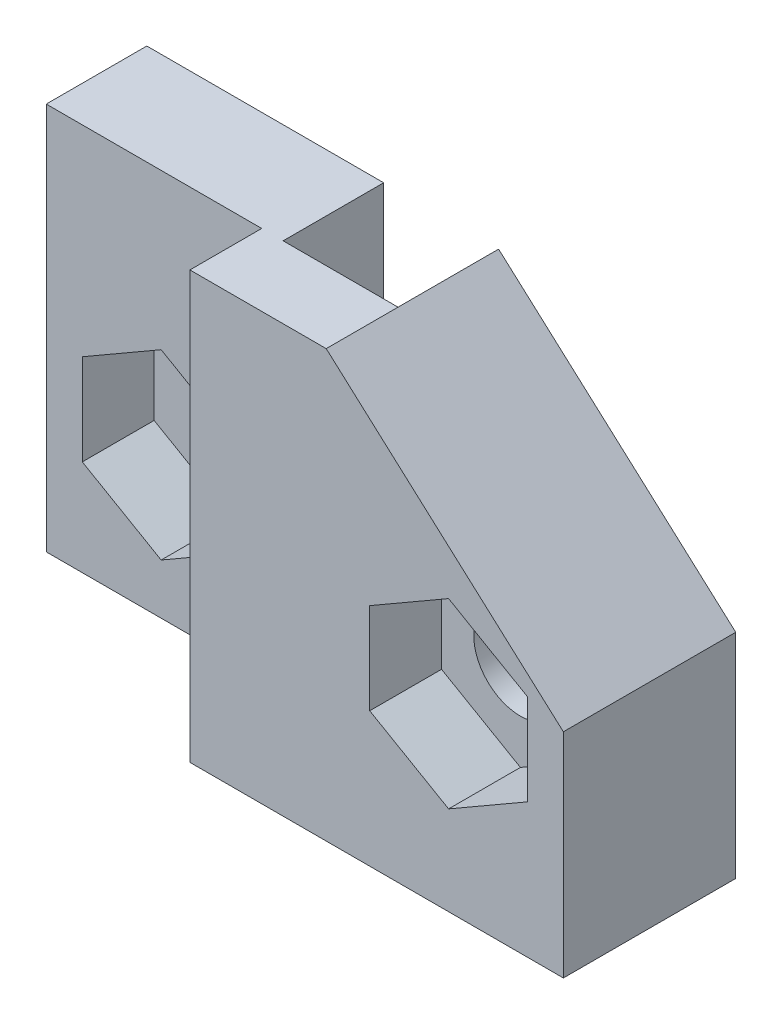
ISO-10303-21;
HEADER;
FILE_DESCRIPTION(('STEP AP214'),'2;1');
FILE_NAME('part.step','',(''),(''),'','','');
FILE_SCHEMA(('AUTOMOTIVE_DESIGN { 1 0 10303 214 1 1 1 1 }'));
ENDSEC;
DATA;
#1=APPLICATION_CONTEXT('core data for automotive mechanical design processes');
#2=APPLICATION_PROTOCOL_DEFINITION('international standard','automotive_design',2000,#1);
#3=PRODUCT_CONTEXT('',#1,'mechanical');
#4=PRODUCT('Part','Part','',(#3));
#5=PRODUCT_RELATED_PRODUCT_CATEGORY('part','',(#4));
#6=PRODUCT_DEFINITION_FORMATION('','',#4);
#7=PRODUCT_DEFINITION_CONTEXT('part definition',#1,'design');
#8=PRODUCT_DEFINITION('design','',#6,#7);
#9=PRODUCT_DEFINITION_SHAPE('','',#8);
#10=(LENGTH_UNIT() NAMED_UNIT(*) SI_UNIT(.MILLI.,.METRE.));
#11=(NAMED_UNIT(*) PLANE_ANGLE_UNIT() SI_UNIT($,.RADIAN.));
#12=(NAMED_UNIT(*) SI_UNIT($,.STERADIAN.) SOLID_ANGLE_UNIT());
#13=UNCERTAINTY_MEASURE_WITH_UNIT(LENGTH_MEASURE(1.E-05),#10,'distance_accuracy_value','');
#14=(GEOMETRIC_REPRESENTATION_CONTEXT(3) GLOBAL_UNCERTAINTY_ASSIGNED_CONTEXT((#13)) GLOBAL_UNIT_ASSIGNED_CONTEXT((#10,
#11,#12)) REPRESENTATION_CONTEXT('',''));
#15=CARTESIAN_POINT('',(0.,0.,0.));
#16=DIRECTION('',(0.,0.,1.));
#17=DIRECTION('',(1.,0.,0.));
#18=AXIS2_PLACEMENT_3D('',#15,#16,#17);
#19=CARTESIAN_POINT('',(169.47767153,-75.223646,0.));
#20=DIRECTION('',(1.,0.,0.));
#21=DIRECTION('',(0.,0.,-1.));
#22=AXIS2_PLACEMENT_3D('',#19,#20,#21);
#23=PLANE('',#22);
#24=DIRECTION('',(0.,0.,1.));
#25=VECTOR('',#24,1.);
#26=CARTESIAN_POINT('',(169.47767153,-66.648646,0.));
#27=LINE('',#26,#25);
#28=CARTESIAN_POINT('',(169.47767153,-66.648646,0.));
#29=VERTEX_POINT('',#28);
#30=CARTESIAN_POINT('',(169.47767153,-66.648646,3.5));
#31=VERTEX_POINT('',#30);
#32=EDGE_CURVE('E213',#29,#31,#27,.T.);
#33=ORIENTED_EDGE('',*,*,#32,.T.);
#34=DIRECTION('',(0.,-1.,0.));
#35=VECTOR('',#34,1.);
#36=CARTESIAN_POINT('',(169.47767153,-66.648646,3.5));
#37=LINE('',#36,#35);
#38=CARTESIAN_POINT('',(169.47767153,-75.223646,3.5));
#39=VERTEX_POINT('',#38);
#40=EDGE_CURVE('E199',#31,#39,#37,.T.);
#41=ORIENTED_EDGE('',*,*,#40,.T.);
#42=DIRECTION('',(0.,0.,1.));
#43=VECTOR('',#42,1.);
#44=CARTESIAN_POINT('',(169.47767153,-75.223646,0.));
#45=LINE('',#44,#43);
#46=CARTESIAN_POINT('',(169.47767153,-75.223646,0.));
#47=VERTEX_POINT('',#46);
#48=EDGE_CURVE('E210',#47,#39,#45,.T.);
#49=ORIENTED_EDGE('',*,*,#48,.F.);
#50=DIRECTION('',(0.,1.,0.));
#51=VECTOR('',#50,1.);
#52=CARTESIAN_POINT('',(169.47767153,-75.223646,0.));
#53=LINE('',#52,#51);
#54=EDGE_CURVE('E309',#47,#29,#53,.T.);
#55=ORIENTED_EDGE('',*,*,#54,.T.);
#56=EDGE_LOOP('',(#33,#41,#49,#55));
#57=FACE_BOUND('',#56,.T.);
#58=ADVANCED_FACE('F33',(#57),#23,.T.);
#59=CARTESIAN_POINT('',(173.47767153,-75.223646,0.));
#60=DIRECTION('',(0.,1.,0.));
#61=DIRECTION('',(0.,0.,1.));
#62=AXIS2_PLACEMENT_3D('',#59,#60,#61);
#63=PLANE('',#62);
#64=ORIENTED_EDGE('',*,*,#48,.T.);
#65=DIRECTION('',(1.,0.,0.));
#66=VECTOR('',#65,1.);
#67=CARTESIAN_POINT('',(169.47767153,-75.223646,3.5));
#68=LINE('',#67,#66);
#69=CARTESIAN_POINT('',(173.47767153,-75.223646,3.5));
#70=VERTEX_POINT('',#69);
#71=EDGE_CURVE('E195',#39,#70,#68,.T.);
#72=ORIENTED_EDGE('',*,*,#71,.T.);
#73=DIRECTION('',(0.,0.,1.));
#74=VECTOR('',#73,1.);
#75=CARTESIAN_POINT('',(173.47767153,-75.223646,0.));
#76=LINE('',#75,#74);
#77=CARTESIAN_POINT('',(173.47767153,-75.223646,0.));
#78=VERTEX_POINT('',#77);
#79=EDGE_CURVE('E219',#78,#70,#76,.T.);
#80=ORIENTED_EDGE('',*,*,#79,.F.);
#81=DIRECTION('',(-1.,0.,0.));
#82=VECTOR('',#81,1.);
#83=CARTESIAN_POINT('',(173.47767153,-75.223646,0.));
#84=LINE('',#83,#82);
#85=EDGE_CURVE('E218',#78,#47,#84,.T.);
#86=ORIENTED_EDGE('',*,*,#85,.T.);
#87=EDGE_LOOP('',(#64,#72,#80,#86));
#88=FACE_BOUND('',#87,.T.);
#89=ADVANCED_FACE('F216',(#88),#63,.T.);
#90=CARTESIAN_POINT('',(173.47767153,-75.223646,0.));
#91=DIRECTION('',(-1.,0.,0.));
#92=DIRECTION('',(0.,0.,1.));
#93=AXIS2_PLACEMENT_3D('',#90,#91,#92);
#94=PLANE('',#93);
#95=ORIENTED_EDGE('',*,*,#79,.T.);
#96=DIRECTION('',(0.,1.,0.));
#97=VECTOR('',#96,1.);
#98=CARTESIAN_POINT('',(173.47767153,-66.648646,3.5));
#99=LINE('',#98,#97);
#100=CARTESIAN_POINT('',(173.47767153,-66.648646,3.5));
#101=VERTEX_POINT('',#100);
#102=EDGE_CURVE('E202',#70,#101,#99,.T.);
#103=ORIENTED_EDGE('',*,*,#102,.T.);
#104=DIRECTION('',(0.,0.,1.));
#105=VECTOR('',#104,1.);
#106=CARTESIAN_POINT('',(173.47767153,-66.648646,0.));
#107=LINE('',#106,#105);
#108=CARTESIAN_POINT('',(173.47767153,-66.648646,0.));
#109=VERTEX_POINT('',#108);
#110=EDGE_CURVE('E223',#109,#101,#107,.T.);
#111=ORIENTED_EDGE('',*,*,#110,.F.);
#112=DIRECTION('',(0.,-1.,0.));
#113=VECTOR('',#112,1.);
#114=CARTESIAN_POINT('',(173.47767153,-75.223646,0.));
#115=LINE('',#114,#113);
#116=EDGE_CURVE('E305',#109,#78,#115,.T.);
#117=ORIENTED_EDGE('',*,*,#116,.T.);
#118=EDGE_LOOP('',(#95,#103,#111,#117));
#119=FACE_BOUND('',#118,.T.);
#120=ADVANCED_FACE('F359',(#119),#94,.T.);
#121=CARTESIAN_POINT('',(165.232371,-75.223646,3.5));
#122=DIRECTION('',(0.,0.,-1.));
#123=DIRECTION('',(-1.,0.,0.));
#124=AXIS2_PLACEMENT_3D('',#121,#122,#123);
#125=CYLINDRICAL_SURFACE('',#124,1.5);
#126=CARTESIAN_POINT('',(165.232371,-75.223646,0.));
#127=DIRECTION('',(0.,0.,1.));
#128=DIRECTION('',(1.,0.,0.));
#129=AXIS2_PLACEMENT_3D('',#126,#127,#128);
#130=CIRCLE('',#129,1.5);
#131=CARTESIAN_POINT('',(166.732371,-75.223646,0.));
#132=VERTEX_POINT('',#131);
#133=EDGE_CURVE('E230',#132,#132,#130,.T.);
#134=ORIENTED_EDGE('',*,*,#133,.F.);
#135=EDGE_LOOP('',(#134));
#136=FACE_BOUND('',#135,.T.);
#137=CARTESIAN_POINT('',(165.232371,-75.223646,1.));
#138=DIRECTION('',(0.,0.,1.));
#139=DIRECTION('',(1.,0.,0.));
#140=AXIS2_PLACEMENT_3D('',#137,#138,#139);
#141=CIRCLE('',#140,1.5);
#142=CARTESIAN_POINT('',(166.732371,-75.223646,1.));
#143=VERTEX_POINT('',#142);
#144=EDGE_CURVE('E37',#143,#143,#141,.T.);
#145=ORIENTED_EDGE('',*,*,#144,.T.);
#146=EDGE_LOOP('',(#145));
#147=FACE_BOUND('',#146,.T.);
#148=ADVANCED_FACE('F483',(#136,#147),#125,.F.);
#149=CARTESIAN_POINT('',(177.73707047,-75.223646,0.));
#150=DIRECTION('',(0.,0.,1.));
#151=DIRECTION('',(1.,0.,0.));
#152=AXIS2_PLACEMENT_3D('',#149,#150,#151);
#153=CYLINDRICAL_SURFACE('',#152,1.62499999999998);
#154=CARTESIAN_POINT('',(177.73707047,-75.223646,0.));
#155=DIRECTION('',(0.,0.,1.));
#156=DIRECTION('',(1.,0.,0.));
#157=AXIS2_PLACEMENT_3D('',#154,#155,#156);
#158=CIRCLE('',#157,1.62499999999998);
#159=CARTESIAN_POINT('',(179.36207047,-75.223646,0.));
#160=VERTEX_POINT('',#159);
#161=EDGE_CURVE('E299',#160,#160,#158,.T.);
#162=ORIENTED_EDGE('',*,*,#161,.F.);
#163=EDGE_LOOP('',(#162));
#164=FACE_BOUND('',#163,.T.);
#165=CARTESIAN_POINT('',(177.73707047,-75.223646,3.5));
#166=DIRECTION('',(0.,0.,1.));
#167=DIRECTION('',(1.,0.,0.));
#168=AXIS2_PLACEMENT_3D('',#165,#166,#167);
#169=CIRCLE('',#168,1.62499999999998);
#170=CARTESIAN_POINT('',(179.36207047,-75.223646,3.5));
#171=VERTEX_POINT('',#170);
#172=EDGE_CURVE('E261',#171,#171,#169,.F.);
#173=ORIENTED_EDGE('',*,*,#172,.F.);
#174=EDGE_LOOP('',(#173));
#175=FACE_BOUND('',#174,.T.);
#176=ADVANCED_FACE('F488',(#164,#175),#153,.F.);
#177=CARTESIAN_POINT('',(0.,0.,3.5));
#178=DIRECTION('',(0.,0.,1.));
#179=DIRECTION('',(1.,0.,0.));
#180=AXIS2_PLACEMENT_3D('',#177,#178,#179);
#181=PLANE('',#180);
#182=DIRECTION('',(0.86602540378444,-0.499999999999998,0.));
#183=VECTOR('',#182,1.);
#184=CARTESIAN_POINT('',(162.487070470003,-76.808646,3.5));
#185=LINE('',#184,#183);
#186=CARTESIAN_POINT('',(162.487070470003,-76.808646,3.5));
#187=VERTEX_POINT('',#186);
#188=CARTESIAN_POINT('',(165.232371,-78.393646,3.5));
#189=VERTEX_POINT('',#188);
#190=EDGE_CURVE('E50',#187,#189,#185,.T.);
#191=ORIENTED_EDGE('',*,*,#190,.F.);
#192=DIRECTION('',(0.,-1.,0.));
#193=VECTOR('',#192,1.);
#194=CARTESIAN_POINT('',(162.487070470003,-73.638646,3.5));
#195=LINE('',#194,#193);
#196=CARTESIAN_POINT('',(162.487070470003,-73.638646,3.5));
#197=VERTEX_POINT('',#196);
#198=EDGE_CURVE('E372',#197,#187,#195,.T.);
#199=ORIENTED_EDGE('',*,*,#198,.F.);
#200=DIRECTION('',(-0.866025403784438,-0.500000000000001,0.));
#201=VECTOR('',#200,1.);
#202=CARTESIAN_POINT('',(165.232371,-72.053646,3.5));
#203=LINE('',#202,#201);
#204=CARTESIAN_POINT('',(165.232371,-72.053646,3.5));
#205=VERTEX_POINT('',#204);
#206=EDGE_CURVE('E396',#205,#197,#203,.T.);
#207=ORIENTED_EDGE('',*,*,#206,.F.);
#208=DIRECTION('',(-0.866025403784439,0.499999999999999,0.));
#209=VECTOR('',#208,1.);
#210=CARTESIAN_POINT('',(167.977671529997,-73.638646,3.5));
#211=LINE('',#210,#209);
#212=CARTESIAN_POINT('',(167.977671529997,-73.638646,3.5));
#213=VERTEX_POINT('',#212);
#214=EDGE_CURVE('E393',#213,#205,#211,.T.);
#215=ORIENTED_EDGE('',*,*,#214,.F.);
#216=DIRECTION('',(0.,1.,0.));
#217=VECTOR('',#216,1.);
#218=CARTESIAN_POINT('',(167.977671529997,-76.808646,3.5));
#219=LINE('',#218,#217);
#220=CARTESIAN_POINT('',(167.977671529997,-76.808646,3.5));
#221=VERTEX_POINT('',#220);
#222=EDGE_CURVE('E390',#221,#213,#219,.T.);
#223=ORIENTED_EDGE('',*,*,#222,.F.);
#224=DIRECTION('',(0.86602540378444,0.499999999999998,0.));
#225=VECTOR('',#224,1.);
#226=CARTESIAN_POINT('',(165.232371,-78.393646,3.5));
#227=LINE('',#226,#225);
#228=EDGE_CURVE('E363',#189,#221,#227,.T.);
#229=ORIENTED_EDGE('',*,*,#228,.F.);
#230=EDGE_LOOP('',(#191,#199,#207,#215,#223,#229));
#231=FACE_BOUND('',#230,.T.);
#232=DIRECTION('',(0.,1.,0.));
#233=VECTOR('',#232,1.);
#234=CARTESIAN_POINT('',(168.732371,-66.648646,3.5));
#235=LINE('',#234,#233);
#236=CARTESIAN_POINT('',(168.732371,-81.493646,3.5));
#237=VERTEX_POINT('',#236);
#238=CARTESIAN_POINT('',(168.732371,-66.648646,3.5));
#239=VERTEX_POINT('',#238);
#240=EDGE_CURVE('E235',#237,#239,#235,.T.);
#241=ORIENTED_EDGE('',*,*,#240,.T.);
#242=DIRECTION('',(-1.,0.,0.));
#243=VECTOR('',#242,1.);
#244=CARTESIAN_POINT('',(168.732371,-66.648646,3.5));
#245=LINE('',#244,#243);
#246=CARTESIAN_POINT('',(161.232371,-66.648646,3.5));
#247=VERTEX_POINT('',#246);
#248=EDGE_CURVE('E238',#239,#247,#245,.T.);
#249=ORIENTED_EDGE('',*,*,#248,.T.);
#250=DIRECTION('',(0.,-1.,0.));
#251=VECTOR('',#250,1.);
#252=CARTESIAN_POINT('',(161.232371,-80.148646,3.5));
#253=LINE('',#252,#251);
#254=CARTESIAN_POINT('',(161.232371,-80.148646,3.5));
#255=VERTEX_POINT('',#254);
#256=EDGE_CURVE('E241',#247,#255,#253,.T.);
#257=ORIENTED_EDGE('',*,*,#256,.T.);
#258=DIRECTION('',(1.,0.,0.));
#259=VECTOR('',#258,1.);
#260=CARTESIAN_POINT('',(161.232371,-80.148646,3.5));
#261=LINE('',#260,#259);
#262=CARTESIAN_POINT('',(167.387371,-80.148646,3.5));
#263=VERTEX_POINT('',#262);
#264=EDGE_CURVE('E243',#255,#263,#261,.T.);
#265=ORIENTED_EDGE('',*,*,#264,.T.);
#266=DIRECTION('',(0.707106781186551,-0.707106781186544,0.));
#267=VECTOR('',#266,1.);
#268=CARTESIAN_POINT('',(168.732371,-81.493646,3.5));
#269=LINE('',#268,#267);
#270=EDGE_CURVE('E245',#263,#237,#269,.T.);
#271=ORIENTED_EDGE('',*,*,#270,.T.);
#272=EDGE_LOOP('',(#241,#249,#257,#265,#271));
#273=FACE_BOUND('',#272,.T.);
#274=ADVANCED_FACE('F339',(#231,#273),#181,.T.);
#275=CARTESIAN_POINT('',(0.,0.,0.));
#276=DIRECTION('',(0.,0.,1.));
#277=DIRECTION('',(1.,0.,0.));
#278=AXIS2_PLACEMENT_3D('',#275,#276,#277);
#279=PLANE('',#278);
#280=DIRECTION('',(-1.,0.,0.));
#281=VECTOR('',#280,1.);
#282=CARTESIAN_POINT('',(168.732371,-66.648646,0.));
#283=LINE('',#282,#281);
#284=CARTESIAN_POINT('',(161.232371,-66.648646,0.));
#285=VERTEX_POINT('',#284);
#286=EDGE_CURVE('E233',#29,#285,#283,.T.);
#287=ORIENTED_EDGE('',*,*,#286,.F.);
#288=ORIENTED_EDGE('',*,*,#54,.F.);
#289=ORIENTED_EDGE('',*,*,#85,.F.);
#290=ORIENTED_EDGE('',*,*,#116,.F.);
#291=DIRECTION('',(-0.74359549886798,0.668629743627428,0.));
#292=VECTOR('',#291,1.);
#293=CARTESIAN_POINT('',(173.47767153,-66.648646,0.));
#294=LINE('',#293,#292);
#295=CARTESIAN_POINT('',(181.732371,-74.071146,0.));
#296=VERTEX_POINT('',#295);
#297=EDGE_CURVE('E302',#296,#109,#294,.T.);
#298=ORIENTED_EDGE('',*,*,#297,.F.);
#299=DIRECTION('',(0.,1.,0.));
#300=VECTOR('',#299,1.);
#301=CARTESIAN_POINT('',(181.732371,-81.493646,0.));
#302=LINE('',#301,#300);
#303=CARTESIAN_POINT('',(181.732371,-81.493646,0.));
#304=VERTEX_POINT('',#303);
#305=EDGE_CURVE('E229',#304,#296,#302,.T.);
#306=ORIENTED_EDGE('',*,*,#305,.F.);
#307=DIRECTION('',(1.,0.,0.));
#308=VECTOR('',#307,1.);
#309=CARTESIAN_POINT('',(168.732371,-81.493646,0.));
#310=LINE('',#309,#308);
#311=CARTESIAN_POINT('',(168.732371,-81.493646,0.));
#312=VERTEX_POINT('',#311);
#313=EDGE_CURVE('E311',#312,#304,#310,.T.);
#314=ORIENTED_EDGE('',*,*,#313,.F.);
#315=DIRECTION('',(0.707106781186551,-0.707106781186544,0.));
#316=VECTOR('',#315,1.);
#317=CARTESIAN_POINT('',(168.732371,-81.493646,0.));
#318=LINE('',#317,#316);
#319=CARTESIAN_POINT('',(167.387371,-80.148646,0.));
#320=VERTEX_POINT('',#319);
#321=EDGE_CURVE('E239',#320,#312,#318,.T.);
#322=ORIENTED_EDGE('',*,*,#321,.F.);
#323=DIRECTION('',(1.,0.,0.));
#324=VECTOR('',#323,1.);
#325=CARTESIAN_POINT('',(161.232371,-80.148646,0.));
#326=LINE('',#325,#324);
#327=CARTESIAN_POINT('',(161.232371,-80.148646,0.));
#328=VERTEX_POINT('',#327);
#329=EDGE_CURVE('E252',#328,#320,#326,.T.);
#330=ORIENTED_EDGE('',*,*,#329,.F.);
#331=DIRECTION('',(0.,-1.,0.));
#332=VECTOR('',#331,1.);
#333=CARTESIAN_POINT('',(161.232371,-80.148646,0.));
#334=LINE('',#333,#332);
#335=EDGE_CURVE('E250',#285,#328,#334,.T.);
#336=ORIENTED_EDGE('',*,*,#335,.F.);
#337=EDGE_LOOP('',(#287,#288,#289,#290,#298,#306,#314,#322,#330,#336));
#338=FACE_BOUND('',#337,.T.);
#339=ORIENTED_EDGE('',*,*,#133,.T.);
#340=EDGE_LOOP('',(#339));
#341=FACE_BOUND('',#340,.T.);
#342=ORIENTED_EDGE('',*,*,#161,.T.);
#343=EDGE_LOOP('',(#342));
#344=FACE_BOUND('',#343,.T.);
#345=ADVANCED_FACE('F347',(#338,#341,#344),#279,.F.);
#346=CARTESIAN_POINT('',(168.732371,-66.648646,3.5));
#347=DIRECTION('',(0.,-1.,0.));
#348=DIRECTION('',(0.,0.,-1.));
#349=AXIS2_PLACEMENT_3D('',#346,#347,#348);
#350=PLANE('',#349);
#351=ORIENTED_EDGE('',*,*,#286,.T.);
#352=DIRECTION('',(0.,0.,-1.));
#353=VECTOR('',#352,1.);
#354=CARTESIAN_POINT('',(161.232371,-66.648646,3.5));
#355=LINE('',#354,#353);
#356=EDGE_CURVE('E11',#247,#285,#355,.T.);
#357=ORIENTED_EDGE('',*,*,#356,.F.);
#358=ORIENTED_EDGE('',*,*,#248,.F.);
#359=DIRECTION('',(0.,0.,1.));
#360=VECTOR('',#359,1.);
#361=CARTESIAN_POINT('',(168.732371,-66.648646,0.));
#362=LINE('',#361,#360);
#363=CARTESIAN_POINT('',(168.732371,-66.648646,6.));
#364=VERTEX_POINT('',#363);
#365=EDGE_CURVE('E221',#239,#364,#362,.T.);
#366=ORIENTED_EDGE('',*,*,#365,.T.);
#367=DIRECTION('',(-1.,0.,0.));
#368=VECTOR('',#367,1.);
#369=CARTESIAN_POINT('',(168.732371,-66.648646,6.));
#370=LINE('',#369,#368);
#371=CARTESIAN_POINT('',(173.47767153,-66.648646,6.));
#372=VERTEX_POINT('',#371);
#373=EDGE_CURVE('E268',#372,#364,#370,.T.);
#374=ORIENTED_EDGE('',*,*,#373,.F.);
#375=DIRECTION('',(0.,0.,1.));
#376=VECTOR('',#375,1.);
#377=CARTESIAN_POINT('',(173.47767153,-66.648646,3.5));
#378=LINE('',#377,#376);
#379=EDGE_CURVE('E360',#101,#372,#378,.T.);
#380=ORIENTED_EDGE('',*,*,#379,.F.);
#381=DIRECTION('',(-1.,0.,0.));
#382=VECTOR('',#381,1.);
#383=CARTESIAN_POINT('',(169.47767153,-66.648646,3.5));
#384=LINE('',#383,#382);
#385=EDGE_CURVE('E361',#101,#31,#384,.T.);
#386=ORIENTED_EDGE('',*,*,#385,.T.);
#387=ORIENTED_EDGE('',*,*,#32,.F.);
#388=EDGE_LOOP('',(#351,#357,#358,#366,#374,#380,#386,#387));
#389=FACE_BOUND('',#388,.T.);
#390=ADVANCED_FACE('F35',(#389),#350,.F.);
#391=CARTESIAN_POINT('',(161.232371,-80.148646,3.5));
#392=DIRECTION('',(1.,0.,0.));
#393=DIRECTION('',(0.,0.,-1.));
#394=AXIS2_PLACEMENT_3D('',#391,#392,#393);
#395=PLANE('',#394);
#396=ORIENTED_EDGE('',*,*,#335,.T.);
#397=DIRECTION('',(0.,0.,-1.));
#398=VECTOR('',#397,1.);
#399=CARTESIAN_POINT('',(161.232371,-80.148646,3.5));
#400=LINE('',#399,#398);
#401=EDGE_CURVE('E42',#255,#328,#400,.T.);
#402=ORIENTED_EDGE('',*,*,#401,.F.);
#403=ORIENTED_EDGE('',*,*,#256,.F.);
#404=ORIENTED_EDGE('',*,*,#356,.T.);
#405=EDGE_LOOP('',(#396,#402,#403,#404));
#406=FACE_BOUND('',#405,.T.);
#407=ADVANCED_FACE('F499',(#406),#395,.F.);
#408=CARTESIAN_POINT('',(161.232371,-80.148646,3.5));
#409=DIRECTION('',(0.,1.,0.));
#410=DIRECTION('',(0.,0.,1.));
#411=AXIS2_PLACEMENT_3D('',#408,#409,#410);
#412=PLANE('',#411);
#413=ORIENTED_EDGE('',*,*,#329,.T.);
#414=DIRECTION('',(0.,0.,-1.));
#415=VECTOR('',#414,1.);
#416=CARTESIAN_POINT('',(167.387371,-80.148646,3.5));
#417=LINE('',#416,#415);
#418=EDGE_CURVE('E257',#263,#320,#417,.T.);
#419=ORIENTED_EDGE('',*,*,#418,.F.);
#420=ORIENTED_EDGE('',*,*,#264,.F.);
#421=ORIENTED_EDGE('',*,*,#401,.T.);
#422=EDGE_LOOP('',(#413,#419,#420,#421));
#423=FACE_BOUND('',#422,.T.);
#424=ADVANCED_FACE('F497',(#423),#412,.F.);
#425=CARTESIAN_POINT('',(168.732371,-81.493646,3.5));
#426=DIRECTION('',(0.707106781186544,0.707106781186551,0.));
#427=DIRECTION('',(-0.707106781186551,0.707106781186544,0.));
#428=AXIS2_PLACEMENT_3D('',#425,#426,#427);
#429=PLANE('',#428);
#430=ORIENTED_EDGE('',*,*,#321,.T.);
#431=DIRECTION('',(0.,0.,-1.));
#432=VECTOR('',#431,1.);
#433=CARTESIAN_POINT('',(168.732371,-81.493646,3.5));
#434=LINE('',#433,#432);
#435=EDGE_CURVE('E248',#237,#312,#434,.T.);
#436=ORIENTED_EDGE('',*,*,#435,.F.);
#437=ORIENTED_EDGE('',*,*,#270,.F.);
#438=ORIENTED_EDGE('',*,*,#418,.T.);
#439=EDGE_LOOP('',(#430,#436,#437,#438));
#440=FACE_BOUND('',#439,.T.);
#441=ADVANCED_FACE('F343',(#440),#429,.F.);
#442=CARTESIAN_POINT('',(168.732371,-66.648646,0.));
#443=DIRECTION('',(-1.,0.,0.));
#444=DIRECTION('',(0.,0.,1.));
#445=AXIS2_PLACEMENT_3D('',#442,#443,#444);
#446=PLANE('',#445);
#447=ORIENTED_EDGE('',*,*,#240,.F.);
#448=DIRECTION('',(0.,0.,1.));
#449=VECTOR('',#448,1.);
#450=CARTESIAN_POINT('',(168.732371,-81.493646,0.));
#451=LINE('',#450,#449);
#452=CARTESIAN_POINT('',(168.732371,-81.493646,6.));
#453=VERTEX_POINT('',#452);
#454=EDGE_CURVE('E319',#237,#453,#451,.T.);
#455=ORIENTED_EDGE('',*,*,#454,.T.);
#456=DIRECTION('',(0.,-1.,0.));
#457=VECTOR('',#456,1.);
#458=CARTESIAN_POINT('',(168.732371,-66.648646,6.));
#459=LINE('',#458,#457);
#460=EDGE_CURVE('E290',#364,#453,#459,.T.);
#461=ORIENTED_EDGE('',*,*,#460,.F.);
#462=ORIENTED_EDGE('',*,*,#365,.F.);
#463=EDGE_LOOP('',(#447,#455,#461,#462));
#464=FACE_BOUND('',#463,.T.);
#465=ADVANCED_FACE('F331',(#464),#446,.T.);
#466=CARTESIAN_POINT('',(173.47767153,-66.648646,0.));
#467=DIRECTION('',(0.668629743627428,0.74359549886798,0.));
#468=DIRECTION('',(-0.74359549886798,0.668629743627428,0.));
#469=AXIS2_PLACEMENT_3D('',#466,#467,#468);
#470=PLANE('',#469);
#471=ORIENTED_EDGE('',*,*,#110,.T.);
#472=ORIENTED_EDGE('',*,*,#379,.T.);
#473=DIRECTION('',(-0.74359549886798,0.668629743627428,0.));
#474=VECTOR('',#473,1.);
#475=CARTESIAN_POINT('',(173.47767153,-66.648646,6.));
#476=LINE('',#475,#474);
#477=CARTESIAN_POINT('',(181.732371,-74.071146,6.));
#478=VERTEX_POINT('',#477);
#479=EDGE_CURVE('E263',#478,#372,#476,.T.);
#480=ORIENTED_EDGE('',*,*,#479,.F.);
#481=DIRECTION('',(0.,0.,1.));
#482=VECTOR('',#481,1.);
#483=CARTESIAN_POINT('',(181.732371,-74.071146,0.));
#484=LINE('',#483,#482);
#485=EDGE_CURVE('E234',#296,#478,#484,.T.);
#486=ORIENTED_EDGE('',*,*,#485,.F.);
#487=ORIENTED_EDGE('',*,*,#297,.T.);
#488=EDGE_LOOP('',(#471,#472,#480,#486,#487));
#489=FACE_BOUND('',#488,.T.);
#490=ADVANCED_FACE('F356',(#489),#470,.T.);
#491=CARTESIAN_POINT('',(181.732371,-81.493646,0.));
#492=DIRECTION('',(1.,0.,0.));
#493=DIRECTION('',(0.,0.,-1.));
#494=AXIS2_PLACEMENT_3D('',#491,#492,#493);
#495=PLANE('',#494);
#496=ORIENTED_EDGE('',*,*,#485,.T.);
#497=DIRECTION('',(0.,1.,0.));
#498=VECTOR('',#497,1.);
#499=CARTESIAN_POINT('',(181.732371,-81.493646,6.));
#500=LINE('',#499,#498);
#501=CARTESIAN_POINT('',(181.732371,-81.493646,6.));
#502=VERTEX_POINT('',#501);
#503=EDGE_CURVE('E296',#502,#478,#500,.T.);
#504=ORIENTED_EDGE('',*,*,#503,.F.);
#505=DIRECTION('',(0.,0.,1.));
#506=VECTOR('',#505,1.);
#507=CARTESIAN_POINT('',(181.732371,-81.493646,0.));
#508=LINE('',#507,#506);
#509=EDGE_CURVE('E317',#304,#502,#508,.T.);
#510=ORIENTED_EDGE('',*,*,#509,.F.);
#511=ORIENTED_EDGE('',*,*,#305,.T.);
#512=EDGE_LOOP('',(#496,#504,#510,#511));
#513=FACE_BOUND('',#512,.T.);
#514=ADVANCED_FACE('F354',(#513),#495,.T.);
#515=CARTESIAN_POINT('',(168.732371,-81.493646,0.));
#516=DIRECTION('',(0.,-1.,0.));
#517=DIRECTION('',(0.,0.,-1.));
#518=AXIS2_PLACEMENT_3D('',#515,#516,#517);
#519=PLANE('',#518);
#520=ORIENTED_EDGE('',*,*,#509,.T.);
#521=DIRECTION('',(1.,0.,0.));
#522=VECTOR('',#521,1.);
#523=CARTESIAN_POINT('',(168.732371,-81.493646,6.));
#524=LINE('',#523,#522);
#525=EDGE_CURVE('E293',#453,#502,#524,.T.);
#526=ORIENTED_EDGE('',*,*,#525,.F.);
#527=ORIENTED_EDGE('',*,*,#454,.F.);
#528=ORIENTED_EDGE('',*,*,#435,.T.);
#529=ORIENTED_EDGE('',*,*,#313,.T.);
#530=EDGE_LOOP('',(#520,#526,#527,#528,#529));
#531=FACE_BOUND('',#530,.T.);
#532=ADVANCED_FACE('F334',(#531),#519,.T.);
#533=CARTESIAN_POINT('',(0.,0.,6.));
#534=DIRECTION('',(0.,0.,1.));
#535=DIRECTION('',(1.,0.,0.));
#536=AXIS2_PLACEMENT_3D('',#533,#534,#535);
#537=PLANE('',#536);
#538=ORIENTED_EDGE('',*,*,#479,.T.);
#539=ORIENTED_EDGE('',*,*,#373,.T.);
#540=ORIENTED_EDGE('',*,*,#460,.T.);
#541=ORIENTED_EDGE('',*,*,#525,.T.);
#542=ORIENTED_EDGE('',*,*,#503,.T.);
#543=EDGE_LOOP('',(#538,#539,#540,#541,#542));
#544=FACE_BOUND('',#543,.T.);
#545=DIRECTION('',(0.86602540378444,-0.499999999999998,0.));
#546=VECTOR('',#545,1.);
#547=CARTESIAN_POINT('',(174.991769940003,-76.808646,6.));
#548=LINE('',#547,#546);
#549=CARTESIAN_POINT('',(174.991769940003,-76.808646,6.));
#550=VERTEX_POINT('',#549);
#551=CARTESIAN_POINT('',(177.73707047,-78.393646,6.));
#552=VERTEX_POINT('',#551);
#553=EDGE_CURVE('E58',#550,#552,#548,.T.);
#554=ORIENTED_EDGE('',*,*,#553,.F.);
#555=DIRECTION('',(0.,-1.,0.));
#556=VECTOR('',#555,1.);
#557=CARTESIAN_POINT('',(174.991769940003,-73.638646,6.));
#558=LINE('',#557,#556);
#559=CARTESIAN_POINT('',(174.991769940003,-73.638646,6.));
#560=VERTEX_POINT('',#559);
#561=EDGE_CURVE('E277',#560,#550,#558,.T.);
#562=ORIENTED_EDGE('',*,*,#561,.F.);
#563=DIRECTION('',(-0.866025403784439,-0.499999999999999,0.));
#564=VECTOR('',#563,1.);
#565=CARTESIAN_POINT('',(177.73707047,-72.053646,6.));
#566=LINE('',#565,#564);
#567=CARTESIAN_POINT('',(177.73707047,-72.053646,6.));
#568=VERTEX_POINT('',#567);
#569=EDGE_CURVE('E438',#568,#560,#566,.T.);
#570=ORIENTED_EDGE('',*,*,#569,.F.);
#571=DIRECTION('',(-0.86602540378444,0.499999999999997,0.));
#572=VECTOR('',#571,1.);
#573=CARTESIAN_POINT('',(180.482370999997,-73.638646,6.));
#574=LINE('',#573,#572);
#575=CARTESIAN_POINT('',(180.482370999997,-73.638646,6.));
#576=VERTEX_POINT('',#575);
#577=EDGE_CURVE('E436',#576,#568,#574,.T.);
#578=ORIENTED_EDGE('',*,*,#577,.F.);
#579=DIRECTION('',(0.,1.,0.));
#580=VECTOR('',#579,1.);
#581=CARTESIAN_POINT('',(180.482370999997,-76.808646,6.));
#582=LINE('',#581,#580);
#583=CARTESIAN_POINT('',(180.482370999997,-76.808646,6.));
#584=VERTEX_POINT('',#583);
#585=EDGE_CURVE('E433',#584,#576,#582,.T.);
#586=ORIENTED_EDGE('',*,*,#585,.F.);
#587=DIRECTION('',(0.866025403784438,0.500000000000002,0.));
#588=VECTOR('',#587,1.);
#589=CARTESIAN_POINT('',(177.73707047,-78.393646,6.));
#590=LINE('',#589,#588);
#591=EDGE_CURVE('E430',#552,#584,#590,.T.);
#592=ORIENTED_EDGE('',*,*,#591,.F.);
#593=EDGE_LOOP('',(#554,#562,#570,#578,#586,#592));
#594=FACE_BOUND('',#593,.T.);
#595=ADVANCED_FACE('F327',(#544,#594),#537,.T.);
#596=CARTESIAN_POINT('',(0.,0.,3.5));
#597=DIRECTION('',(0.,0.,1.));
#598=DIRECTION('',(1.,0.,0.));
#599=AXIS2_PLACEMENT_3D('',#596,#597,#598);
#600=PLANE('',#599);
#601=DIRECTION('',(0.86602540378444,-0.499999999999998,0.));
#602=VECTOR('',#601,1.);
#603=CARTESIAN_POINT('',(174.991769940003,-76.808646,3.5));
#604=LINE('',#603,#602);
#605=CARTESIAN_POINT('',(174.991769940003,-76.808646,3.5));
#606=VERTEX_POINT('',#605);
#607=CARTESIAN_POINT('',(177.73707047,-78.393646,3.5));
#608=VERTEX_POINT('',#607);
#609=EDGE_CURVE('E412',#606,#608,#604,.T.);
#610=ORIENTED_EDGE('',*,*,#609,.T.);
#611=DIRECTION('',(0.866025403784438,0.500000000000002,0.));
#612=VECTOR('',#611,1.);
#613=CARTESIAN_POINT('',(177.73707047,-78.393646,3.5));
#614=LINE('',#613,#612);
#615=CARTESIAN_POINT('',(180.482370999997,-76.808646,3.5));
#616=VERTEX_POINT('',#615);
#617=EDGE_CURVE('E415',#608,#616,#614,.T.);
#618=ORIENTED_EDGE('',*,*,#617,.T.);
#619=DIRECTION('',(0.,1.,0.));
#620=VECTOR('',#619,1.);
#621=CARTESIAN_POINT('',(180.482370999997,-76.808646,3.5));
#622=LINE('',#621,#620);
#623=CARTESIAN_POINT('',(180.482370999997,-73.638646,3.5));
#624=VERTEX_POINT('',#623);
#625=EDGE_CURVE('E418',#616,#624,#622,.T.);
#626=ORIENTED_EDGE('',*,*,#625,.T.);
#627=DIRECTION('',(-0.86602540378444,0.499999999999997,0.));
#628=VECTOR('',#627,1.);
#629=CARTESIAN_POINT('',(180.482370999997,-73.638646,3.5));
#630=LINE('',#629,#628);
#631=CARTESIAN_POINT('',(177.73707047,-72.053646,3.5));
#632=VERTEX_POINT('',#631);
#633=EDGE_CURVE('E421',#624,#632,#630,.T.);
#634=ORIENTED_EDGE('',*,*,#633,.T.);
#635=DIRECTION('',(-0.866025403784439,-0.499999999999999,0.));
#636=VECTOR('',#635,1.);
#637=CARTESIAN_POINT('',(177.73707047,-72.053646,3.5));
#638=LINE('',#637,#636);
#639=CARTESIAN_POINT('',(174.991769940003,-73.638646,3.5));
#640=VERTEX_POINT('',#639);
#641=EDGE_CURVE('E424',#632,#640,#638,.T.);
#642=ORIENTED_EDGE('',*,*,#641,.T.);
#643=DIRECTION('',(0.,-1.,0.));
#644=VECTOR('',#643,1.);
#645=CARTESIAN_POINT('',(174.991769940003,-73.638646,3.5));
#646=LINE('',#645,#644);
#647=EDGE_CURVE('E286',#640,#606,#646,.T.);
#648=ORIENTED_EDGE('',*,*,#647,.T.);
#649=EDGE_LOOP('',(#610,#618,#626,#634,#642,#648));
#650=FACE_BOUND('',#649,.T.);
#651=ORIENTED_EDGE('',*,*,#172,.T.);
#652=EDGE_LOOP('',(#651));
#653=FACE_BOUND('',#652,.T.);
#654=ADVANCED_FACE('F455',(#650,#653),#600,.T.);
#655=CARTESIAN_POINT('',(174.991769940003,-76.808646,3.5));
#656=DIRECTION('',(-0.499999999999998,-0.86602540378444,0.));
#657=DIRECTION('',(0.86602540378444,-0.499999999999998,0.));
#658=AXIS2_PLACEMENT_3D('',#655,#656,#657);
#659=PLANE('',#658);
#660=ORIENTED_EDGE('',*,*,#553,.T.);
#661=DIRECTION('',(0.,0.,1.));
#662=VECTOR('',#661,1.);
#663=CARTESIAN_POINT('',(177.73707047,-78.393646,3.5));
#664=LINE('',#663,#662);
#665=EDGE_CURVE('E285',#608,#552,#664,.T.);
#666=ORIENTED_EDGE('',*,*,#665,.F.);
#667=ORIENTED_EDGE('',*,*,#609,.F.);
#668=DIRECTION('',(0.,0.,1.));
#669=VECTOR('',#668,1.);
#670=CARTESIAN_POINT('',(174.991769940003,-76.808646,3.5));
#671=LINE('',#670,#669);
#672=EDGE_CURVE('E264',#606,#550,#671,.T.);
#673=ORIENTED_EDGE('',*,*,#672,.T.);
#674=EDGE_LOOP('',(#660,#666,#667,#673));
#675=FACE_BOUND('',#674,.T.);
#676=ADVANCED_FACE('F453',(#675),#659,.F.);
#677=CARTESIAN_POINT('',(174.991769940003,-73.638646,3.5));
#678=DIRECTION('',(-1.,0.,0.));
#679=DIRECTION('',(0.,0.,1.));
#680=AXIS2_PLACEMENT_3D('',#677,#678,#679);
#681=PLANE('',#680);
#682=ORIENTED_EDGE('',*,*,#561,.T.);
#683=ORIENTED_EDGE('',*,*,#672,.F.);
#684=ORIENTED_EDGE('',*,*,#647,.F.);
#685=DIRECTION('',(0.,0.,1.));
#686=VECTOR('',#685,1.);
#687=CARTESIAN_POINT('',(174.991769940003,-73.638646,3.5));
#688=LINE('',#687,#686);
#689=EDGE_CURVE('E270',#640,#560,#688,.T.);
#690=ORIENTED_EDGE('',*,*,#689,.T.);
#691=EDGE_LOOP('',(#682,#683,#684,#690));
#692=FACE_BOUND('',#691,.T.);
#693=ADVANCED_FACE('F444',(#692),#681,.F.);
#694=CARTESIAN_POINT('',(177.73707047,-72.053646,3.5));
#695=DIRECTION('',(-0.499999999999999,0.866025403784439,0.));
#696=DIRECTION('',(-0.866025403784439,-0.499999999999999,0.));
#697=AXIS2_PLACEMENT_3D('',#694,#695,#696);
#698=PLANE('',#697);
#699=ORIENTED_EDGE('',*,*,#569,.T.);
#700=ORIENTED_EDGE('',*,*,#689,.F.);
#701=ORIENTED_EDGE('',*,*,#641,.F.);
#702=DIRECTION('',(0.,0.,1.));
#703=VECTOR('',#702,1.);
#704=CARTESIAN_POINT('',(177.73707047,-72.053646,3.5));
#705=LINE('',#704,#703);
#706=EDGE_CURVE('E274',#632,#568,#705,.T.);
#707=ORIENTED_EDGE('',*,*,#706,.T.);
#708=EDGE_LOOP('',(#699,#700,#701,#707));
#709=FACE_BOUND('',#708,.T.);
#710=ADVANCED_FACE('F458',(#709),#698,.F.);
#711=CARTESIAN_POINT('',(180.482370999997,-73.638646,3.5));
#712=DIRECTION('',(0.499999999999997,0.86602540378444,0.));
#713=DIRECTION('',(-0.86602540378444,0.499999999999997,0.));
#714=AXIS2_PLACEMENT_3D('',#711,#712,#713);
#715=PLANE('',#714);
#716=ORIENTED_EDGE('',*,*,#577,.T.);
#717=ORIENTED_EDGE('',*,*,#706,.F.);
#718=ORIENTED_EDGE('',*,*,#633,.F.);
#719=DIRECTION('',(0.,0.,1.));
#720=VECTOR('',#719,1.);
#721=CARTESIAN_POINT('',(180.482370999997,-73.638646,3.5));
#722=LINE('',#721,#720);
#723=EDGE_CURVE('E281',#624,#576,#722,.T.);
#724=ORIENTED_EDGE('',*,*,#723,.T.);
#725=EDGE_LOOP('',(#716,#717,#718,#724));
#726=FACE_BOUND('',#725,.T.);
#727=ADVANCED_FACE('F460',(#726),#715,.F.);
#728=CARTESIAN_POINT('',(180.482370999997,-76.808646,3.5));
#729=DIRECTION('',(1.,0.,0.));
#730=DIRECTION('',(0.,0.,-1.));
#731=AXIS2_PLACEMENT_3D('',#728,#729,#730);
#732=PLANE('',#731);
#733=ORIENTED_EDGE('',*,*,#585,.T.);
#734=ORIENTED_EDGE('',*,*,#723,.F.);
#735=ORIENTED_EDGE('',*,*,#625,.F.);
#736=DIRECTION('',(0.,0.,1.));
#737=VECTOR('',#736,1.);
#738=CARTESIAN_POINT('',(180.482370999997,-76.808646,3.5));
#739=LINE('',#738,#737);
#740=EDGE_CURVE('E283',#616,#584,#739,.T.);
#741=ORIENTED_EDGE('',*,*,#740,.T.);
#742=EDGE_LOOP('',(#733,#734,#735,#741));
#743=FACE_BOUND('',#742,.T.);
#744=ADVANCED_FACE('F462',(#743),#732,.F.);
#745=CARTESIAN_POINT('',(177.73707047,-78.393646,3.5));
#746=DIRECTION('',(0.500000000000002,-0.866025403784438,0.));
#747=DIRECTION('',(0.866025403784438,0.500000000000002,0.));
#748=AXIS2_PLACEMENT_3D('',#745,#746,#747);
#749=PLANE('',#748);
#750=ORIENTED_EDGE('',*,*,#591,.T.);
#751=ORIENTED_EDGE('',*,*,#740,.F.);
#752=ORIENTED_EDGE('',*,*,#617,.F.);
#753=ORIENTED_EDGE('',*,*,#665,.T.);
#754=EDGE_LOOP('',(#750,#751,#752,#753));
#755=FACE_BOUND('',#754,.T.);
#756=ADVANCED_FACE('F450',(#755),#749,.F.);
#757=CARTESIAN_POINT('',(162.487070470003,-76.808646,1.));
#758=DIRECTION('',(-0.499999999999998,-0.86602540378444,0.));
#759=DIRECTION('',(0.86602540378444,-0.499999999999998,0.));
#760=AXIS2_PLACEMENT_3D('',#757,#758,#759);
#761=PLANE('',#760);
#762=ORIENTED_EDGE('',*,*,#190,.T.);
#763=DIRECTION('',(0.,0.,1.));
#764=VECTOR('',#763,1.);
#765=CARTESIAN_POINT('',(165.232371,-78.393646,1.));
#766=LINE('',#765,#764);
#767=CARTESIAN_POINT('',(165.232371,-78.393646,1.));
#768=VERTEX_POINT('',#767);
#769=EDGE_CURVE('E386',#768,#189,#766,.T.);
#770=ORIENTED_EDGE('',*,*,#769,.F.);
#771=DIRECTION('',(0.86602540378444,-0.499999999999998,0.));
#772=VECTOR('',#771,1.);
#773=CARTESIAN_POINT('',(162.487070470003,-76.808646,1.));
#774=LINE('',#773,#772);
#775=CARTESIAN_POINT('',(162.487070470003,-76.808646,1.));
#776=VERTEX_POINT('',#775);
#777=EDGE_CURVE('E368',#776,#768,#774,.T.);
#778=ORIENTED_EDGE('',*,*,#777,.F.);
#779=DIRECTION('',(0.,0.,1.));
#780=VECTOR('',#779,1.);
#781=CARTESIAN_POINT('',(162.487070470003,-76.808646,1.));
#782=LINE('',#781,#780);
#783=EDGE_CURVE('E401',#776,#187,#782,.T.);
#784=ORIENTED_EDGE('',*,*,#783,.T.);
#785=EDGE_LOOP('',(#762,#770,#778,#784));
#786=FACE_BOUND('',#785,.T.);
#787=ADVANCED_FACE('F469',(#786),#761,.F.);
#788=CARTESIAN_POINT('',(162.487070470003,-73.638646,1.));
#789=DIRECTION('',(-1.,0.,0.));
#790=DIRECTION('',(0.,0.,1.));
#791=AXIS2_PLACEMENT_3D('',#788,#789,#790);
#792=PLANE('',#791);
#793=ORIENTED_EDGE('',*,*,#198,.T.);
#794=ORIENTED_EDGE('',*,*,#783,.F.);
#795=DIRECTION('',(0.,-1.,0.));
#796=VECTOR('',#795,1.);
#797=CARTESIAN_POINT('',(162.487070470003,-73.638646,1.));
#798=LINE('',#797,#796);
#799=CARTESIAN_POINT('',(162.487070470003,-73.638646,1.));
#800=VERTEX_POINT('',#799);
#801=EDGE_CURVE('E384',#800,#776,#798,.T.);
#802=ORIENTED_EDGE('',*,*,#801,.F.);
#803=DIRECTION('',(0.,0.,1.));
#804=VECTOR('',#803,1.);
#805=CARTESIAN_POINT('',(162.487070470003,-73.638646,1.));
#806=LINE('',#805,#804);
#807=EDGE_CURVE('E403',#800,#197,#806,.T.);
#808=ORIENTED_EDGE('',*,*,#807,.T.);
#809=EDGE_LOOP('',(#793,#794,#802,#808));
#810=FACE_BOUND('',#809,.T.);
#811=ADVANCED_FACE('F599',(#810),#792,.F.);
#812=CARTESIAN_POINT('',(165.232371,-72.053646,1.));
#813=DIRECTION('',(-0.500000000000001,0.866025403784438,0.));
#814=DIRECTION('',(-0.866025403784438,-0.500000000000001,0.));
#815=AXIS2_PLACEMENT_3D('',#812,#813,#814);
#816=PLANE('',#815);
#817=ORIENTED_EDGE('',*,*,#206,.T.);
#818=ORIENTED_EDGE('',*,*,#807,.F.);
#819=DIRECTION('',(-0.866025403784438,-0.500000000000001,0.));
#820=VECTOR('',#819,1.);
#821=CARTESIAN_POINT('',(165.232371,-72.053646,1.));
#822=LINE('',#821,#820);
#823=CARTESIAN_POINT('',(165.232371,-72.053646,1.));
#824=VERTEX_POINT('',#823);
#825=EDGE_CURVE('E381',#824,#800,#822,.T.);
#826=ORIENTED_EDGE('',*,*,#825,.F.);
#827=DIRECTION('',(0.,0.,1.));
#828=VECTOR('',#827,1.);
#829=CARTESIAN_POINT('',(165.232371,-72.053646,1.));
#830=LINE('',#829,#828);
#831=EDGE_CURVE('E405',#824,#205,#830,.T.);
#832=ORIENTED_EDGE('',*,*,#831,.T.);
#833=EDGE_LOOP('',(#817,#818,#826,#832));
#834=FACE_BOUND('',#833,.T.);
#835=ADVANCED_FACE('F589',(#834),#816,.F.);
#836=CARTESIAN_POINT('',(167.977671529997,-73.638646,1.));
#837=DIRECTION('',(0.499999999999999,0.866025403784439,0.));
#838=DIRECTION('',(-0.866025403784439,0.499999999999999,0.));
#839=AXIS2_PLACEMENT_3D('',#836,#837,#838);
#840=PLANE('',#839);
#841=ORIENTED_EDGE('',*,*,#214,.T.);
#842=ORIENTED_EDGE('',*,*,#831,.F.);
#843=DIRECTION('',(-0.866025403784439,0.499999999999999,0.));
#844=VECTOR('',#843,1.);
#845=CARTESIAN_POINT('',(167.977671529997,-73.638646,1.));
#846=LINE('',#845,#844);
#847=CARTESIAN_POINT('',(167.977671529997,-73.638646,1.));
#848=VERTEX_POINT('',#847);
#849=EDGE_CURVE('E378',#848,#824,#846,.T.);
#850=ORIENTED_EDGE('',*,*,#849,.F.);
#851=DIRECTION('',(0.,0.,1.));
#852=VECTOR('',#851,1.);
#853=CARTESIAN_POINT('',(167.977671529997,-73.638646,1.));
#854=LINE('',#853,#852);
#855=EDGE_CURVE('E407',#848,#213,#854,.T.);
#856=ORIENTED_EDGE('',*,*,#855,.T.);
#857=EDGE_LOOP('',(#841,#842,#850,#856));
#858=FACE_BOUND('',#857,.T.);
#859=ADVANCED_FACE('F579',(#858),#840,.F.);
#860=CARTESIAN_POINT('',(167.977671529997,-76.808646,1.));
#861=DIRECTION('',(1.,0.,0.));
#862=DIRECTION('',(0.,0.,-1.));
#863=AXIS2_PLACEMENT_3D('',#860,#861,#862);
#864=PLANE('',#863);
#865=ORIENTED_EDGE('',*,*,#222,.T.);
#866=ORIENTED_EDGE('',*,*,#855,.F.);
#867=DIRECTION('',(0.,1.,0.));
#868=VECTOR('',#867,1.);
#869=CARTESIAN_POINT('',(167.977671529997,-76.808646,1.));
#870=LINE('',#869,#868);
#871=CARTESIAN_POINT('',(167.977671529997,-76.808646,1.));
#872=VERTEX_POINT('',#871);
#873=EDGE_CURVE('E375',#872,#848,#870,.T.);
#874=ORIENTED_EDGE('',*,*,#873,.F.);
#875=DIRECTION('',(0.,0.,1.));
#876=VECTOR('',#875,1.);
#877=CARTESIAN_POINT('',(167.977671529997,-76.808646,1.));
#878=LINE('',#877,#876);
#879=EDGE_CURVE('E409',#872,#221,#878,.T.);
#880=ORIENTED_EDGE('',*,*,#879,.T.);
#881=EDGE_LOOP('',(#865,#866,#874,#880));
#882=FACE_BOUND('',#881,.T.);
#883=ADVANCED_FACE('F569',(#882),#864,.F.);
#884=CARTESIAN_POINT('',(165.232371,-78.393646,1.));
#885=DIRECTION('',(0.499999999999998,-0.86602540378444,0.));
#886=DIRECTION('',(0.86602540378444,0.499999999999998,0.));
#887=AXIS2_PLACEMENT_3D('',#884,#885,#886);
#888=PLANE('',#887);
#889=ORIENTED_EDGE('',*,*,#228,.T.);
#890=ORIENTED_EDGE('',*,*,#879,.F.);
#891=DIRECTION('',(0.86602540378444,0.499999999999998,0.));
#892=VECTOR('',#891,1.);
#893=CARTESIAN_POINT('',(165.232371,-78.393646,1.));
#894=LINE('',#893,#892);
#895=EDGE_CURVE('E371',#768,#872,#894,.T.);
#896=ORIENTED_EDGE('',*,*,#895,.F.);
#897=ORIENTED_EDGE('',*,*,#769,.T.);
#898=EDGE_LOOP('',(#889,#890,#896,#897));
#899=FACE_BOUND('',#898,.T.);
#900=ADVANCED_FACE('F558',(#899),#888,.F.);
#901=CARTESIAN_POINT('',(0.,0.,1.));
#902=DIRECTION('',(0.,0.,1.));
#903=DIRECTION('',(1.,0.,0.));
#904=AXIS2_PLACEMENT_3D('',#901,#902,#903);
#905=PLANE('',#904);
#906=ORIENTED_EDGE('',*,*,#144,.F.);
#907=EDGE_LOOP('',(#906));
#908=FACE_BOUND('',#907,.T.);
#909=ORIENTED_EDGE('',*,*,#777,.T.);
#910=ORIENTED_EDGE('',*,*,#895,.T.);
#911=ORIENTED_EDGE('',*,*,#873,.T.);
#912=ORIENTED_EDGE('',*,*,#849,.T.);
#913=ORIENTED_EDGE('',*,*,#825,.T.);
#914=ORIENTED_EDGE('',*,*,#801,.T.);
#915=EDGE_LOOP('',(#909,#910,#911,#912,#913,#914));
#916=FACE_BOUND('',#915,.T.);
#917=ADVANCED_FACE('F553',(#908,#916),#905,.T.);
#918=CARTESIAN_POINT('',(0.,0.,3.5));
#919=DIRECTION('',(0.,0.,1.));
#920=DIRECTION('',(1.,0.,0.));
#921=AXIS2_PLACEMENT_3D('',#918,#919,#920);
#922=PLANE('',#921);
#923=ORIENTED_EDGE('',*,*,#40,.F.);
#924=ORIENTED_EDGE('',*,*,#385,.F.);
#925=ORIENTED_EDGE('',*,*,#102,.F.);
#926=ORIENTED_EDGE('',*,*,#71,.F.);
#927=EDGE_LOOP('',(#923,#924,#925,#926));
#928=FACE_BOUND('',#927,.T.);
#929=ADVANCED_FACE('F197',(#928),#922,.F.);
#930=CLOSED_SHELL('',(#58,#89,#120,#148,#176,#274,#345,#390,#407,#424,#441,#465,#490,#514,#532,
#595,#654,#676,#693,#710,#727,#744,#756,#787,#811,#835,#859,#883,#900,#917,#929));
#931=MANIFOLD_SOLID_BREP('B2',#930);
#932=ADVANCED_BREP_SHAPE_REPRESENTATION('',(#18,#931),#14);
#933=SHAPE_DEFINITION_REPRESENTATION(#9,#932);
ENDSEC;
END-ISO-10303-21;
